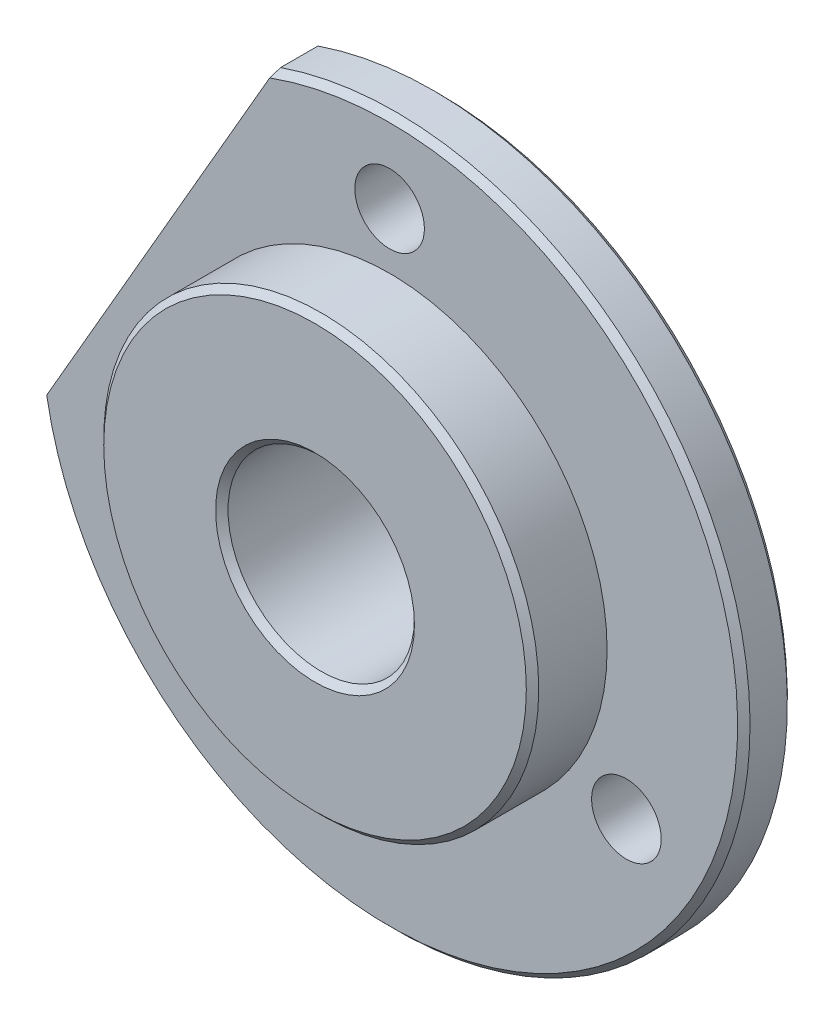
ISO-10303-21;
HEADER;
FILE_DESCRIPTION(('STEP AP214'),'2;1');
FILE_NAME('part.step','',(''),(''),'','','');
FILE_SCHEMA(('AUTOMOTIVE_DESIGN { 1 0 10303 214 1 1 1 1 }'));
ENDSEC;
DATA;
#1=APPLICATION_CONTEXT('core data for automotive mechanical design processes');
#2=APPLICATION_PROTOCOL_DEFINITION('international standard','automotive_design',2000,#1);
#3=PRODUCT_CONTEXT('',#1,'mechanical');
#4=PRODUCT('Part','Part','',(#3));
#5=PRODUCT_RELATED_PRODUCT_CATEGORY('part','',(#4));
#6=PRODUCT_DEFINITION_FORMATION('','',#4);
#7=PRODUCT_DEFINITION_CONTEXT('part definition',#1,'design');
#8=PRODUCT_DEFINITION('design','',#6,#7);
#9=PRODUCT_DEFINITION_SHAPE('','',#8);
#10=(LENGTH_UNIT() NAMED_UNIT(*) SI_UNIT(.MILLI.,.METRE.));
#11=(NAMED_UNIT(*) PLANE_ANGLE_UNIT() SI_UNIT($,.RADIAN.));
#12=(NAMED_UNIT(*) SI_UNIT($,.STERADIAN.) SOLID_ANGLE_UNIT());
#13=UNCERTAINTY_MEASURE_WITH_UNIT(LENGTH_MEASURE(1.E-05),#10,'distance_accuracy_value','');
#14=(GEOMETRIC_REPRESENTATION_CONTEXT(3) GLOBAL_UNCERTAINTY_ASSIGNED_CONTEXT((#13)) GLOBAL_UNIT_ASSIGNED_CONTEXT((#10,
#11,#12)) REPRESENTATION_CONTEXT('',''));
#15=CARTESIAN_POINT('',(0.,0.,0.));
#16=DIRECTION('',(0.,0.,1.));
#17=DIRECTION('',(1.,0.,0.));
#18=AXIS2_PLACEMENT_3D('',#15,#16,#17);
#19=CARTESIAN_POINT('',(0.,0.,20.3950347257728));
#20=DIRECTION('',(0.,0.,-1.));
#21=DIRECTION('',(-1.,0.,0.));
#22=AXIS2_PLACEMENT_3D('',#19,#20,#21);
#23=CYLINDRICAL_SURFACE('',#22,28.5);
#24=DIRECTION('',(0.,0.,-1.));
#25=VECTOR('',#24,1.);
#26=CARTESIAN_POINT('',(-27.9736896483002,-5.45185174602017,20.3950347257728));
#27=LINE('',#26,#25);
#28=CARTESIAN_POINT('',(-27.9736896483002,-5.45185174602017,16.8950347257733));
#29=VERTEX_POINT('',#28);
#30=CARTESIAN_POINT('',(-27.9736896483002,-5.45185174602017,19.8950347257728));
#31=VERTEX_POINT('',#30);
#32=EDGE_CURVE('E164',#29,#31,#27,.F.);
#33=ORIENTED_EDGE('',*,*,#32,.F.);
#34=CARTESIAN_POINT('',(0.,0.,16.8950347257733));
#35=DIRECTION('',(0.,0.,1.));
#36=DIRECTION('',(1.,0.,0.));
#37=AXIS2_PLACEMENT_3D('',#34,#35,#36);
#38=CIRCLE('',#37,28.5);
#39=CARTESIAN_POINT('',(-9.26540271443014,26.9518517460198,16.8950347257733));
#40=VERTEX_POINT('',#39);
#41=EDGE_CURVE('E192',#29,#40,#38,.T.);
#42=ORIENTED_EDGE('',*,*,#41,.T.);
#43=DIRECTION('',(0.,0.,-1.));
#44=VECTOR('',#43,1.);
#45=CARTESIAN_POINT('',(-9.26540271443014,26.9518517460198,20.3950347257728));
#46=LINE('',#45,#44);
#47=CARTESIAN_POINT('',(-9.26540271443014,26.9518517460198,19.8950347257728));
#48=VERTEX_POINT('',#47);
#49=EDGE_CURVE('E471',#48,#40,#46,.T.);
#50=ORIENTED_EDGE('',*,*,#49,.F.);
#51=CARTESIAN_POINT('',(0.,0.,19.8950347257728));
#52=DIRECTION('',(0.,0.,1.));
#53=DIRECTION('',(1.,0.,0.));
#54=AXIS2_PLACEMENT_3D('',#51,#52,#53);
#55=CIRCLE('',#54,28.5);
#56=EDGE_CURVE('E189',#48,#31,#55,.F.);
#57=ORIENTED_EDGE('',*,*,#56,.T.);
#58=EDGE_LOOP('',(#33,#42,#50,#57));
#59=FACE_BOUND('',#58,.T.);
#60=ADVANCED_FACE('F50',(#59),#23,.T.);
#61=CARTESIAN_POINT('',(0.,0.,20.3950347257728));
#62=DIRECTION('',(0.,0.,1.));
#63=DIRECTION('',(1.,0.,0.));
#64=AXIS2_PLACEMENT_3D('',#61,#62,#63);
#65=PLANE('',#64);
#66=CARTESIAN_POINT('',(-1.94289029309402E-13,22.,20.3950347257726));
#67=DIRECTION('',(0.,0.,-1.));
#68=DIRECTION('',(-0.5,-0.866025403784439,0.));
#69=AXIS2_PLACEMENT_3D('',#66,#67,#68);
#70=CIRCLE('',#69,2.8);
#71=CARTESIAN_POINT('',(-1.4000000000002,19.5751288694035,20.3950347257726));
#72=VERTEX_POINT('',#71);
#73=EDGE_CURVE('E178',#72,#72,#70,.T.);
#74=ORIENTED_EDGE('',*,*,#73,.T.);
#75=EDGE_LOOP('',(#74));
#76=FACE_BOUND('',#75,.T.);
#77=CARTESIAN_POINT('',(19.0525588832575,-10.9999999999998,20.3950347257726));
#78=DIRECTION('',(0.,0.,-1.));
#79=DIRECTION('',(-0.5,0.866025403784439,0.));
#80=AXIS2_PLACEMENT_3D('',#77,#78,#79);
#81=CIRCLE('',#80,2.8);
#82=CARTESIAN_POINT('',(17.6525588832575,-8.57512886940342,20.3950347257726));
#83=VERTEX_POINT('',#82);
#84=EDGE_CURVE('E174',#83,#83,#81,.T.);
#85=ORIENTED_EDGE('',*,*,#84,.T.);
#86=EDGE_LOOP('',(#85));
#87=FACE_BOUND('',#86,.T.);
#88=CARTESIAN_POINT('',(-19.0525588832577,-11.,20.3950347257726));
#89=DIRECTION('',(0.,0.,-1.));
#90=DIRECTION('',(1.,0.,0.));
#91=AXIS2_PLACEMENT_3D('',#88,#89,#90);
#92=CIRCLE('',#91,2.8);
#93=CARTESIAN_POINT('',(-16.2525588832577,-11.,20.3950347257726));
#94=VERTEX_POINT('',#93);
#95=EDGE_CURVE('E159',#94,#94,#92,.T.);
#96=ORIENTED_EDGE('',*,*,#95,.T.);
#97=EDGE_LOOP('',(#96));
#98=FACE_BOUND('',#97,.T.);
#99=CARTESIAN_POINT('',(0.,0.,20.3950347257728));
#100=DIRECTION('',(0.,0.,1.));
#101=DIRECTION('',(1.,0.,0.));
#102=AXIS2_PLACEMENT_3D('',#99,#100,#101);
#103=CIRCLE('',#102,17.5);
#104=CARTESIAN_POINT('',(17.5,0.,20.3950347257728));
#105=VERTEX_POINT('',#104);
#106=EDGE_CURVE('E470',#105,#105,#103,.T.);
#107=ORIENTED_EDGE('',*,*,#106,.F.);
#108=EDGE_LOOP('',(#107));
#109=FACE_BOUND('',#108,.T.);
#110=DIRECTION('',(-0.5,-0.866025403784439,0.));
#111=VECTOR('',#110,1.);
#112=CARTESIAN_POINT('',(-8.09416053474007,28.9805027092108,20.3950347257727));
#113=LINE('',#112,#111);
#114=CARTESIAN_POINT('',(-9.65085062403894,26.2842363829062,20.3950347257727));
#115=VERTEX_POINT('',#114);
#116=CARTESIAN_POINT('',(-27.5882417386914,-4.78423638290651,20.3950347257727));
#117=VERTEX_POINT('',#116);
#118=EDGE_CURVE('E158',#115,#117,#113,.T.);
#119=ORIENTED_EDGE('',*,*,#118,.T.);
#120=CARTESIAN_POINT('',(0.,0.,20.3950347257728));
#121=DIRECTION('',(0.,0.,1.));
#122=DIRECTION('',(1.,0.,0.));
#123=AXIS2_PLACEMENT_3D('',#120,#121,#122);
#124=CIRCLE('',#123,28.);
#125=EDGE_CURVE('E286',#117,#115,#124,.T.);
#126=ORIENTED_EDGE('',*,*,#125,.T.);
#127=EDGE_LOOP('',(#119,#126));
#128=FACE_BOUND('',#127,.T.);
#129=ADVANCED_FACE('F245',(#76,#87,#98,#109,#128),#65,.T.);
#130=CARTESIAN_POINT('',(0.,0.,16.3950347257733));
#131=DIRECTION('',(0.,0.,1.));
#132=DIRECTION('',(1.,0.,0.));
#133=AXIS2_PLACEMENT_3D('',#130,#131,#132);
#134=PLANE('',#133);
#135=CARTESIAN_POINT('',(-1.94289029309402E-13,22.,16.3950347257733));
#136=DIRECTION('',(0.,0.,1.));
#137=DIRECTION('',(1.,0.,0.));
#138=AXIS2_PLACEMENT_3D('',#135,#136,#137);
#139=CIRCLE('',#138,2.8);
#140=CARTESIAN_POINT('',(2.7999999999998,22.,16.3950347257733));
#141=VERTEX_POINT('',#140);
#142=EDGE_CURVE('E175',#141,#141,#139,.F.);
#143=ORIENTED_EDGE('',*,*,#142,.F.);
#144=EDGE_LOOP('',(#143));
#145=FACE_BOUND('',#144,.T.);
#146=CARTESIAN_POINT('',(19.0525588832575,-10.9999999999998,16.3950347257733));
#147=DIRECTION('',(0.,0.,1.));
#148=DIRECTION('',(1.,0.,0.));
#149=AXIS2_PLACEMENT_3D('',#146,#147,#148);
#150=CIRCLE('',#149,2.8);
#151=CARTESIAN_POINT('',(21.8525588832575,-10.9999999999998,16.3950347257733));
#152=VERTEX_POINT('',#151);
#153=EDGE_CURVE('E167',#152,#152,#150,.F.);
#154=ORIENTED_EDGE('',*,*,#153,.F.);
#155=EDGE_LOOP('',(#154));
#156=FACE_BOUND('',#155,.T.);
#157=CARTESIAN_POINT('',(-19.0525588832577,-11.,16.3950347257733));
#158=DIRECTION('',(0.,0.,1.));
#159=DIRECTION('',(1.,0.,0.));
#160=AXIS2_PLACEMENT_3D('',#157,#158,#159);
#161=CIRCLE('',#160,2.8);
#162=CARTESIAN_POINT('',(-16.2525588832577,-11.,16.3950347257733));
#163=VERTEX_POINT('',#162);
#164=EDGE_CURVE('E153',#163,#163,#161,.F.);
#165=ORIENTED_EDGE('',*,*,#164,.F.);
#166=EDGE_LOOP('',(#165));
#167=FACE_BOUND('',#166,.T.);
#168=CARTESIAN_POINT('',(0.,0.,16.3950347257733));
#169=DIRECTION('',(0.,0.,-1.));
#170=DIRECTION('',(1.,0.,0.));
#171=AXIS2_PLACEMENT_3D('',#168,#169,#170);
#172=CIRCLE('',#171,11.);
#173=CARTESIAN_POINT('',(11.,0.,16.3950347257733));
#174=VERTEX_POINT('',#173);
#175=EDGE_CURVE('E468',#174,#174,#172,.T.);
#176=ORIENTED_EDGE('',*,*,#175,.F.);
#177=EDGE_LOOP('',(#176));
#178=FACE_BOUND('',#177,.T.);
#179=DIRECTION('',(-0.5,-0.866025403784439,0.));
#180=VECTOR('',#179,1.);
#181=CARTESIAN_POINT('',(-18.6195461813652,10.7499999999998,16.3950347257733));
#182=LINE('',#181,#180);
#183=CARTESIAN_POINT('',(-9.65085062403893,26.2842363829062,16.3950347257733));
#184=VERTEX_POINT('',#183);
#185=CARTESIAN_POINT('',(-27.5882417386914,-4.78423638290652,16.3950347257733));
#186=VERTEX_POINT('',#185);
#187=EDGE_CURVE('E171',#184,#186,#182,.T.);
#188=ORIENTED_EDGE('',*,*,#187,.F.);
#189=CARTESIAN_POINT('',(0.,0.,16.3950347257733));
#190=DIRECTION('',(0.,0.,1.));
#191=DIRECTION('',(1.,0.,0.));
#192=AXIS2_PLACEMENT_3D('',#189,#190,#191);
#193=CIRCLE('',#192,28.);
#194=EDGE_CURVE('E284',#184,#186,#193,.F.);
#195=ORIENTED_EDGE('',*,*,#194,.T.);
#196=EDGE_LOOP('',(#188,#195));
#197=FACE_BOUND('',#196,.T.);
#198=ADVANCED_FACE('F251',(#145,#156,#167,#178,#197),#134,.F.);
#199=CARTESIAN_POINT('',(0.,0.,5.99503472577306));
#200=DIRECTION('',(0.,0.,1.));
#201=DIRECTION('',(-1.,0.,0.));
#202=AXIS2_PLACEMENT_3D('',#199,#200,#201);
#203=CYLINDRICAL_SURFACE('',#202,11.);
#204=CARTESIAN_POINT('',(0.,11.,9.59503472577307));
#205=CARTESIAN_POINT('',(0.116820725576944,10.9999978716946,9.59503914708373));
#206=CARTESIAN_POINT('',(0.233698534099584,10.998119850411,9.60481558062744));
#207=CARTESIAN_POINT('',(0.464157905615967,10.9908091013027,9.64363626190238));
#208=CARTESIAN_POINT('',(0.57773664830955,10.9853734203977,9.67269651669106));
#209=CARTESIAN_POINT('',(0.798231854962633,10.971555114344,9.74916040343549));
#210=CARTESIAN_POINT('',(0.905154329044485,10.9631751944279,9.79654720056781));
#211=CARTESIAN_POINT('',(1.10952197105222,10.9443823920309,9.90827064418986));
#212=CARTESIAN_POINT('',(1.20696785099233,10.9339696624603,9.97260601591655));
#213=CARTESIAN_POINT('',(1.39083315056374,10.9121153708468,10.1172465329172));
#214=CARTESIAN_POINT('',(1.47711814339733,10.9006636700964,10.1977210454418));
#215=CARTESIAN_POINT('',(1.63504914599608,10.8780969643664,10.3719912012417));
#216=CARTESIAN_POINT('',(1.70669408031201,10.8669819841731,10.4657878222931));
#217=CARTESIAN_POINT('',(1.83387383294999,10.846248530383,10.6649941861905));
#218=CARTESIAN_POINT('',(1.88927125270465,10.8366431219602,10.7704931283785));
#219=CARTESIAN_POINT('',(1.98150370285159,10.8201595335974,10.98951459304));
#220=CARTESIAN_POINT('',(2.01834039568987,10.8132811094188,11.1030363958834));
#221=CARTESIAN_POINT('',(2.07197297779094,10.8031324791883,11.3334406144317));
#222=CARTESIAN_POINT('',(2.08900368367653,10.7998200312509,11.4502664726619));
#223=CARTESIAN_POINT('',(2.10326984536433,10.7970511009874,11.6851607628698));
#224=CARTESIAN_POINT('',(2.10050714236934,10.7975942600088,11.8032290782526));
#225=CARTESIAN_POINT('',(2.07545516737426,10.8024367355995,12.0355510866324));
#226=CARTESIAN_POINT('',(2.05343348606592,10.8066845758642,12.1498348665908));
#227=CARTESIAN_POINT('',(1.99091034192166,10.8183768812613,12.3730554009638));
#228=CARTESIAN_POINT('',(1.95040806775305,10.8258214867369,12.481991920391));
#229=CARTESIAN_POINT('',(1.85181340852171,10.8431219988389,12.6922054344847));
#230=CARTESIAN_POINT('',(1.79361350474933,10.8529925716594,12.793430743651));
#231=CARTESIAN_POINT('',(1.66135166063383,10.8740232315002,12.9847793458424));
#232=CARTESIAN_POINT('',(1.5872880534515,10.8851834539704,13.0749014706595));
#233=CARTESIAN_POINT('',(1.42396113527216,10.9077598901504,13.2430310039915));
#234=CARTESIAN_POINT('',(1.33446907578982,10.9191773056637,13.3208162072706));
#235=CARTESIAN_POINT('',(1.14358963010241,10.9408141182614,13.4603039737921));
#236=CARTESIAN_POINT('',(1.04220211619592,10.9510335024823,13.5220063643575));
#237=CARTESIAN_POINT('',(0.830173985720091,10.9691445924971,13.6276119633276));
#238=CARTESIAN_POINT('',(0.719521272357275,10.9770331923933,13.671491450637));
#239=CARTESIAN_POINT('',(0.492231221002959,10.9895700020058,13.7399777442366));
#240=CARTESIAN_POINT('',(0.375594543986819,10.994218568785,13.7645866742472));
#241=CARTESIAN_POINT('',(0.14155857078908,10.9997023168961,13.7935225953311));
#242=CARTESIAN_POINT('',(0.0241982028024535,11.0005947180859,13.7981539438369));
#243=CARTESIAN_POINT('',(-0.209619824877444,10.9986238776324,13.7878205140451));
#244=CARTESIAN_POINT('',(-0.326077530314277,10.9957608275698,13.7728567353733));
#245=CARTESIAN_POINT('',(-0.553814645909537,10.9866364587913,13.7240108144022));
#246=CARTESIAN_POINT('',(-0.665128421406164,10.9804029187552,13.6902832533981));
#247=CARTESIAN_POINT('',(-0.880521177551999,10.9652337163749,13.6050348864641));
#248=CARTESIAN_POINT('',(-0.984599652469112,10.9562978653781,13.5535128382367));
#249=CARTESIAN_POINT('',(-1.18386224069497,10.9365725392396,13.4334684454554));
#250=CARTESIAN_POINT('',(-1.27893275643845,10.9257632883234,13.3647608559687));
#251=CARTESIAN_POINT('',(-1.45630391231596,10.9035399615061,13.2125457010323));
#252=CARTESIAN_POINT('',(-1.53860331172027,10.8921258269841,13.1290366992934));
#253=CARTESIAN_POINT('',(-1.68925742062279,10.8697885323371,12.9482092694096));
#254=CARTESIAN_POINT('',(-1.75740408816819,10.8588743179934,12.8507162227844));
#255=CARTESIAN_POINT('',(-1.87635388160976,10.8389551363277,12.6454878439318));
#256=CARTESIAN_POINT('',(-1.92715766623363,10.8299500964951,12.537752900917));
#257=CARTESIAN_POINT('',(-2.00968750691374,10.8149396007345,12.3156177666262));
#258=CARTESIAN_POINT('',(-2.0415074890195,10.8089194021741,12.2012535147169));
#259=CARTESIAN_POINT('',(-2.08545491288345,10.8005271750239,11.9686757538008));
#260=CARTESIAN_POINT('',(-2.09758466771721,10.7981547179237,11.8504626985901));
#261=CARTESIAN_POINT('',(-2.10172771567789,10.7973488784542,11.6156281377085));
#262=CARTESIAN_POINT('',(-2.09406932225051,10.7988512071435,11.4990125191777));
#263=CARTESIAN_POINT('',(-2.05957380647279,10.8054828208103,11.2687637866407));
#264=CARTESIAN_POINT('',(-2.03273680883038,10.8106120822039,11.1551306532462));
#265=CARTESIAN_POINT('',(-1.96078655360532,10.8238920998987,10.9342577461912));
#266=CARTESIAN_POINT('',(-1.91571010674722,10.8320367677302,10.8270055916178));
#267=CARTESIAN_POINT('',(-1.80859687396578,10.8504339754288,10.6215341759364));
#268=CARTESIAN_POINT('',(-1.74655882937287,10.8606866717125,10.5233155859055));
#269=CARTESIAN_POINT('',(-1.60614737217546,10.882343519302,10.3370573732936));
#270=CARTESIAN_POINT('',(-1.52753550738089,10.8937630641247,10.2491992672889));
#271=CARTESIAN_POINT('',(-1.35670385401088,10.9163530130373,10.0878121588375));
#272=CARTESIAN_POINT('',(-1.26448094399106,10.9275233592998,10.0142864522648));
#273=CARTESIAN_POINT('',(-1.06800710017792,10.9484794793606,9.88300462307268));
#274=CARTESIAN_POINT('',(-0.963651395128439,10.9582512733661,9.82540299247188));
#275=CARTESIAN_POINT('',(-0.74658886485383,10.9751724982229,9.728642698514));
#276=CARTESIAN_POINT('',(-0.633889912861657,10.9823243644284,9.68946689775509));
#277=CARTESIAN_POINT('',(-0.434066702020293,10.9917600690319,9.63852715651208));
#278=CARTESIAN_POINT('',(-0.348102728929784,10.9948324249591,9.62224568730497));
#279=CARTESIAN_POINT('',(-0.174769795845607,10.9989531592246,9.60049796429922));
#280=CARTESIAN_POINT('',(-0.0874008739257631,11.0000015923181,9.59503141791469));
#281=CARTESIAN_POINT('',(0.,11.,9.59503472577307));
#282=B_SPLINE_CURVE_WITH_KNOTS('',3,(#204,#205,#206,#207,#208,#209,#210,#211,#212,#213,#214,
#215,#216,#217,#218,#219,#220,#221,#222,#223,#224,#225,#226,#227,#228,#229,#230,#231,#232,#233,
#234,#235,#236,#237,#238,#239,#240,#241,#242,#243,#244,#245,#246,#247,#248,#249,#250,#251,#252,
#253,#254,#255,#256,#257,#258,#259,#260,#261,#262,#263,#264,#265,#266,#267,#268,#269,#270,#271,
#272,#273,#274,#275,#276,#277,#278,#279,#280,#281),.UNSPECIFIED.,.T.,.F.,(4,2,2,2,2,2,2,2,2,2,2,
2,2,2,2,2,2,2,2,2,2,2,2,2,2,2,2,2,2,2,2,2,2,2,2,2,2,2,4),(0.,0.350142517562091,
0.700576044571203,1.05068842385536,1.40077447744675,1.7547471970617,2.10874590994354,
2.46565720490661,2.82253652637637,3.17514016136572,3.52771099723601,3.87545955963107,
4.22322339030958,4.5731437012802,4.92310079731015,5.27878057366823,5.6344641687088,
5.99061961582656,6.34673580714868,6.69740698623476,7.0480602768805,7.39586667355603,
7.74369735676448,8.09545238647772,8.44724156826096,8.80388396846403,9.16051282095549,
9.51536222599584,9.87016994269547,10.2191288359621,10.5680854601612,10.9163413075931,
11.2646230050701,11.6183069023624,11.9720720369891,12.3291576381856,12.6859104630516,
12.9478810152831,13.2098444800908),.UNSPECIFIED.);
#283=CARTESIAN_POINT('',(0.,11.,9.59503472577307));
#284=VERTEX_POINT('',#283);
#285=EDGE_CURVE('E327',#284,#284,#282,.T.);
#286=ORIENTED_EDGE('',*,*,#285,.T.);
#287=EDGE_LOOP('',(#286));
#288=FACE_BOUND('',#287,.T.);
#289=CARTESIAN_POINT('',(11.,0.,13.7950347257731));
#290=CARTESIAN_POINT('',(10.9999978716946,0.116820725576944,13.7950303044624));
#291=CARTESIAN_POINT('',(10.998119850411,0.233698534099584,13.7852538709187));
#292=CARTESIAN_POINT('',(10.9908091013027,0.464157905615969,13.7464331896438));
#293=CARTESIAN_POINT('',(10.9853734203977,0.577736648309552,13.7173729348551));
#294=CARTESIAN_POINT('',(10.971555114344,0.798231854962635,13.6409090481106));
#295=CARTESIAN_POINT('',(10.9631751944279,0.905154329044487,13.5935222509783));
#296=CARTESIAN_POINT('',(10.9443823920309,1.10952197105222,13.4817988073563));
#297=CARTESIAN_POINT('',(10.9339696624603,1.20696785099233,13.4174634356296));
#298=CARTESIAN_POINT('',(10.9121153708468,1.39083315056375,13.2728229186289));
#299=CARTESIAN_POINT('',(10.9006636700964,1.47711814339733,13.1923484061043));
#300=CARTESIAN_POINT('',(10.8780969643664,1.63504914599609,13.0180782503044));
#301=CARTESIAN_POINT('',(10.8669819841731,1.70669408031202,12.924281629253));
#302=CARTESIAN_POINT('',(10.846248530383,1.83387383294999,12.7250752653556));
#303=CARTESIAN_POINT('',(10.8366431219602,1.88927125270465,12.6195763231676));
#304=CARTESIAN_POINT('',(10.8201595335974,1.98150370285159,12.4005548585062));
#305=CARTESIAN_POINT('',(10.8132811094188,2.01834039568988,12.2870330556628));
#306=CARTESIAN_POINT('',(10.8031324791883,2.07197297779094,12.0566288371144));
#307=CARTESIAN_POINT('',(10.7998200312509,2.08900368367654,11.9398029788842));
#308=CARTESIAN_POINT('',(10.7970511009874,2.10326984536434,11.7049086886763));
#309=CARTESIAN_POINT('',(10.7975942600088,2.10050714236935,11.5868403732935));
#310=CARTESIAN_POINT('',(10.8024367355995,2.07545516737427,11.3545183649138));
#311=CARTESIAN_POINT('',(10.8066845758642,2.05343348606592,11.2402345849553));
#312=CARTESIAN_POINT('',(10.8183768812613,1.99091034192167,11.0170140505823));
#313=CARTESIAN_POINT('',(10.8258214867369,1.95040806775306,10.9080775311551));
#314=CARTESIAN_POINT('',(10.8431219988389,1.85181340852171,10.6978640170614));
#315=CARTESIAN_POINT('',(10.8529925716594,1.79361350474933,10.5966387078951));
#316=CARTESIAN_POINT('',(10.8740232315002,1.66135166063383,10.4052901057037));
#317=CARTESIAN_POINT('',(10.8851834539704,1.5872880534515,10.3151679808866));
#318=CARTESIAN_POINT('',(10.9077598901504,1.42396113527216,10.1470384475546));
#319=CARTESIAN_POINT('',(10.9191773056637,1.33446907578983,10.0692532442755));
#320=CARTESIAN_POINT('',(10.9408141182614,1.14358963010241,9.92976547775399));
#321=CARTESIAN_POINT('',(10.9510335024823,1.04220211619593,9.86806308718858));
#322=CARTESIAN_POINT('',(10.9691445924971,0.830173985720095,9.76245748821856));
#323=CARTESIAN_POINT('',(10.9770331923933,0.719521272357278,9.71857800090916));
#324=CARTESIAN_POINT('',(10.9895700020058,0.492231221002961,9.65009170730953));
#325=CARTESIAN_POINT('',(10.994218568785,0.375594543986821,9.62548277729895));
#326=CARTESIAN_POINT('',(10.9997023168961,0.141558570789083,9.59654685621501));
#327=CARTESIAN_POINT('',(11.0005947180859,0.0241982028024558,9.59191550770926));
#328=CARTESIAN_POINT('',(10.9986238776324,-0.209619824877442,9.60224893750101));
#329=CARTESIAN_POINT('',(10.9957608275698,-0.326077530314276,9.61721271617282));
#330=CARTESIAN_POINT('',(10.9866364587913,-0.553814645909537,9.66605863714388));
#331=CARTESIAN_POINT('',(10.9804029187552,-0.665128421406164,9.69978619814803));
#332=CARTESIAN_POINT('',(10.9652337163749,-0.880521177551999,9.78503456508202));
#333=CARTESIAN_POINT('',(10.9562978653781,-0.984599652469114,9.8365566133094));
#334=CARTESIAN_POINT('',(10.9365725392395,-1.18386224069497,9.95660100609071));
#335=CARTESIAN_POINT('',(10.9257632883234,-1.27893275643845,10.0253085955774));
#336=CARTESIAN_POINT('',(10.9035399615061,-1.45630391231597,10.1775237505138));
#337=CARTESIAN_POINT('',(10.8921258269841,-1.53860331172027,10.2610327522528));
#338=CARTESIAN_POINT('',(10.8697885323371,-1.68925742062279,10.4418601821366));
#339=CARTESIAN_POINT('',(10.8588743179934,-1.75740408816819,10.5393532287617));
#340=CARTESIAN_POINT('',(10.8389551363277,-1.87635388160976,10.7445816076143));
#341=CARTESIAN_POINT('',(10.8299500964951,-1.92715766623364,10.8523165506291));
#342=CARTESIAN_POINT('',(10.8149396007345,-2.00968750691375,11.07445168492));
#343=CARTESIAN_POINT('',(10.8089194021741,-2.04150748901951,11.1888159368292));
#344=CARTESIAN_POINT('',(10.8005271750239,-2.08545491288345,11.4213936977453));
#345=CARTESIAN_POINT('',(10.7981547179237,-2.09758466771721,11.5396067529561));
#346=CARTESIAN_POINT('',(10.7973488784542,-2.10172771567789,11.7744413138376));
#347=CARTESIAN_POINT('',(10.7988512071435,-2.09406932225052,11.8910569323685));
#348=CARTESIAN_POINT('',(10.8054828208103,-2.0595738064728,12.1213056649054));
#349=CARTESIAN_POINT('',(10.8106120822039,-2.03273680883039,12.2349387983));
#350=CARTESIAN_POINT('',(10.8238920998987,-1.96078655360532,12.4558117053549));
#351=CARTESIAN_POINT('',(10.8320367677302,-1.91571010674722,12.5630638599283));
#352=CARTESIAN_POINT('',(10.8504339754288,-1.80859687396579,12.7685352756097));
#353=CARTESIAN_POINT('',(10.8606866717125,-1.74655882937287,12.8667538656407));
#354=CARTESIAN_POINT('',(10.882343519302,-1.60614737217547,13.0530120782525));
#355=CARTESIAN_POINT('',(10.8937630641247,-1.52753550738089,13.1408701842572));
#356=CARTESIAN_POINT('',(10.9163530130373,-1.35670385401088,13.3022572927086));
#357=CARTESIAN_POINT('',(10.9275233592998,-1.26448094399107,13.3757829992813));
#358=CARTESIAN_POINT('',(10.9484794793606,-1.06800710017792,13.5070648284734));
#359=CARTESIAN_POINT('',(10.9582512733661,-0.963651395128445,13.5646664590742));
#360=CARTESIAN_POINT('',(10.9751724982229,-0.746588864853835,13.6614267530321));
#361=CARTESIAN_POINT('',(10.9823243644284,-0.633889912861661,13.700602553791));
#362=CARTESIAN_POINT('',(10.9917600690319,-0.434066702020296,13.751542295034));
#363=CARTESIAN_POINT('',(10.9948324249591,-0.348102728929786,13.7678237642412));
#364=CARTESIAN_POINT('',(10.9989531592246,-0.174769795845608,13.7895714872469));
#365=CARTESIAN_POINT('',(11.0000015923181,-0.0874008739257637,13.7950380336314));
#366=CARTESIAN_POINT('',(11.,0.,13.7950347257731));
#367=B_SPLINE_CURVE_WITH_KNOTS('',3,(#289,#290,#291,#292,#293,#294,#295,#296,#297,#298,#299,
#300,#301,#302,#303,#304,#305,#306,#307,#308,#309,#310,#311,#312,#313,#314,#315,#316,#317,#318,
#319,#320,#321,#322,#323,#324,#325,#326,#327,#328,#329,#330,#331,#332,#333,#334,#335,#336,#337,
#338,#339,#340,#341,#342,#343,#344,#345,#346,#347,#348,#349,#350,#351,#352,#353,#354,#355,#356,
#357,#358,#359,#360,#361,#362,#363,#364,#365,#366),.UNSPECIFIED.,.T.,.F.,(4,2,2,2,2,2,2,2,2,2,2,
2,2,2,2,2,2,2,2,2,2,2,2,2,2,2,2,2,2,2,2,2,2,2,2,2,2,2,4),(0.,0.350142517562091,
0.700576044571205,1.05068842385536,1.40077447744676,1.75474719706171,2.10874590994354,
2.46565720490662,2.82253652637638,3.17514016136573,3.52771099723602,3.87545955963108,
4.2232233903096,4.57314370128021,4.92310079731016,5.27878057366824,5.63446416870882,
5.99061961582658,6.3467358071487,6.69740698623478,7.04806027688052,7.39586667355605,
7.74369735676451,8.09545238647775,8.44724156826098,8.80388396846406,9.16051282095551,
9.51536222599587,9.87016994269549,10.2191288359621,10.5680854601613,10.9163413075931,
11.2646230050702,11.6183069023625,11.9720720369892,12.3291576381857,12.6859104630517,
12.9478810152831,13.2098444800909),.UNSPECIFIED.);
#368=CARTESIAN_POINT('',(11.,0.,13.7950347257731));
#369=VERTEX_POINT('',#368);
#370=EDGE_CURVE('E326',#369,#369,#367,.T.);
#371=ORIENTED_EDGE('',*,*,#370,.T.);
#372=EDGE_LOOP('',(#371));
#373=FACE_BOUND('',#372,.T.);
#374=CARTESIAN_POINT('',(0.,0.,7.49503472577306));
#375=DIRECTION('',(0.,0.,1.));
#376=DIRECTION('',(1.,0.,0.));
#377=AXIS2_PLACEMENT_3D('',#374,#375,#376);
#378=CIRCLE('',#377,11.);
#379=CARTESIAN_POINT('',(11.,0.,7.49503472577306));
#380=VERTEX_POINT('',#379);
#381=EDGE_CURVE('E11',#380,#380,#378,.T.);
#382=ORIENTED_EDGE('',*,*,#381,.T.);
#383=EDGE_LOOP('',(#382));
#384=FACE_BOUND('',#383,.T.);
#385=ORIENTED_EDGE('',*,*,#175,.T.);
#386=EDGE_LOOP('',(#385));
#387=FACE_BOUND('',#386,.T.);
#388=ADVANCED_FACE('F348',(#288,#373,#384,#387),#203,.T.);
#389=CARTESIAN_POINT('',(0.,0.,26.3950347257726));
#390=DIRECTION('',(0.,0.,-1.));
#391=DIRECTION('',(-1.,0.,0.));
#392=AXIS2_PLACEMENT_3D('',#389,#390,#391);
#393=CYLINDRICAL_SURFACE('',#392,17.5);
#394=CARTESIAN_POINT('',(0.,0.,25.8950347257726));
#395=DIRECTION('',(0.,0.,1.));
#396=DIRECTION('',(1.,0.,0.));
#397=AXIS2_PLACEMENT_3D('',#394,#395,#396);
#398=CIRCLE('',#397,17.5);
#399=CARTESIAN_POINT('',(17.5,0.,25.8950347257726));
#400=VERTEX_POINT('',#399);
#401=EDGE_CURVE('E74',#400,#400,#398,.F.);
#402=ORIENTED_EDGE('',*,*,#401,.T.);
#403=EDGE_LOOP('',(#402));
#404=FACE_BOUND('',#403,.T.);
#405=ORIENTED_EDGE('',*,*,#106,.T.);
#406=EDGE_LOOP('',(#405));
#407=FACE_BOUND('',#406,.T.);
#408=ADVANCED_FACE('F298',(#404,#407),#393,.T.);
#409=CARTESIAN_POINT('',(0.,0.,26.3950347257726));
#410=DIRECTION('',(0.,0.,1.));
#411=DIRECTION('',(1.,0.,0.));
#412=AXIS2_PLACEMENT_3D('',#409,#410,#411);
#413=PLANE('',#412);
#414=CARTESIAN_POINT('',(0.,0.,26.3950347257726));
#415=DIRECTION('',(0.,0.,1.));
#416=DIRECTION('',(1.,0.,0.));
#417=AXIS2_PLACEMENT_3D('',#414,#415,#416);
#418=CIRCLE('',#417,8.);
#419=CARTESIAN_POINT('',(8.,0.,26.3950347257726));
#420=VERTEX_POINT('',#419);
#421=EDGE_CURVE('E184',#420,#420,#418,.F.);
#422=ORIENTED_EDGE('',*,*,#421,.T.);
#423=EDGE_LOOP('',(#422));
#424=FACE_BOUND('',#423,.T.);
#425=CARTESIAN_POINT('',(0.,0.,26.3950347257726));
#426=DIRECTION('',(0.,0.,1.));
#427=DIRECTION('',(1.,0.,0.));
#428=AXIS2_PLACEMENT_3D('',#425,#426,#427);
#429=CIRCLE('',#428,17.);
#430=CARTESIAN_POINT('',(17.,0.,26.3950347257726));
#431=VERTEX_POINT('',#430);
#432=EDGE_CURVE('E80',#431,#431,#429,.T.);
#433=ORIENTED_EDGE('',*,*,#432,.T.);
#434=EDGE_LOOP('',(#433));
#435=FACE_BOUND('',#434,.T.);
#436=ADVANCED_FACE('F302',(#424,#435),#413,.T.);
#437=CARTESIAN_POINT('',(0.,0.,-7.62737963362596));
#438=DIRECTION('',(0.,0.,1.));
#439=DIRECTION('',(-1.,0.,0.));
#440=AXIS2_PLACEMENT_3D('',#437,#438,#439);
#441=CYLINDRICAL_SURFACE('',#440,7.5);
#442=CARTESIAN_POINT('',(0.,7.5,9.59503472577307));
#443=CARTESIAN_POINT('',(0.115549071859457,7.49999850044544,9.59503699170472));
#444=CARTESIAN_POINT('',(0.231121705110065,7.4973036885812,9.60460342738784));
#445=CARTESIAN_POINT('',(0.458923495634751,7.48681582636739,9.64253980837897));
#446=CARTESIAN_POINT('',(0.571151263080414,7.47902068682222,9.67091745919722));
#447=CARTESIAN_POINT('',(0.788943238195506,7.45919014801396,9.74547070565651));
#448=CARTESIAN_POINT('',(0.894516296930382,7.4471605273756,9.79162205428635));
#449=CARTESIAN_POINT('',(1.09642476541401,7.420124150391,9.90031899394834));
#450=CARTESIAN_POINT('',(1.19275931288064,7.40511711654645,9.96286611325969));
#451=CARTESIAN_POINT('',(1.37589761639296,7.37331332850794,10.1042515844632));
#452=CARTESIAN_POINT('',(1.46243395483419,7.35648356700851,10.1834288976835));
#453=CARTESIAN_POINT('',(1.62118994975329,7.32313712362264,10.3551034918851));
#454=CARTESIAN_POINT('',(1.69340755595235,7.30662048687786,10.4476026771373));
#455=CARTESIAN_POINT('',(1.82281954418509,7.27542837897222,10.6454792139444));
#456=CARTESIAN_POINT('',(1.87969906189858,7.26079431852522,10.751069620531));
#457=CARTESIAN_POINT('',(1.97478943248913,7.23551274440862,10.9707916756159));
#458=CARTESIAN_POINT('',(2.01300412356119,7.22486441122792,11.0849215625023));
#459=CARTESIAN_POINT('',(2.06873752873864,7.20910195955085,11.3155045543103));
#460=CARTESIAN_POINT('',(2.08674433574883,7.20385758469793,11.4318305545111));
#461=CARTESIAN_POINT('',(2.10307354988689,7.19910829329382,11.6659614814214));
#462=CARTESIAN_POINT('',(2.10140004786119,7.1996021839581,11.7837660956933));
#463=CARTESIAN_POINT('',(2.07880203719544,7.20615747477845,12.0136402869739));
#464=CARTESIAN_POINT('',(2.05847601372621,7.21204577982249,12.1257744321409));
#465=CARTESIAN_POINT('',(2.00011173806163,7.22844816907821,12.3449732608953));
#466=CARTESIAN_POINT('',(1.96207194147722,7.23896265662278,12.4520375015621));
#467=CARTESIAN_POINT('',(1.86889065894203,7.2635793822286,12.6595799556169));
#468=CARTESIAN_POINT('',(1.81354549979215,7.27772396889439,12.7599614888474));
#469=CARTESIAN_POINT('',(1.68746638599935,7.30798533076004,12.9502191190989));
#470=CARTESIAN_POINT('',(1.61672912560208,7.32410252929097,13.040092953002));
#471=CARTESIAN_POINT('',(1.4588475528645,7.35720651544555,13.2101941181439));
#472=CARTESIAN_POINT('',(1.37120287335206,7.37420368441479,13.2899557175051));
#473=CARTESIAN_POINT('',(1.18357169751816,7.40663279030198,13.4337494208029));
#474=CARTESIAN_POINT('',(1.08358461129691,7.42206465234252,13.4977807724817));
#475=CARTESIAN_POINT('',(0.873337450332598,7.44973605200326,13.6085309176554));
#476=CARTESIAN_POINT('',(0.763026733669777,7.46195859911619,13.6551580984553));
#477=CARTESIAN_POINT('',(0.535710183719849,7.48171171416257,13.7290673870195));
#478=CARTESIAN_POINT('',(0.418705976174601,7.48924341618883,13.7563541708791));
#479=CARTESIAN_POINT('',(0.185292401498555,7.498591647067,13.7900598488604));
#480=CARTESIAN_POINT('',(0.0689811489871956,7.50058131296794,13.7971111343153));
#481=CARTESIAN_POINT('',(-0.163164639318413,7.49912299982235,13.7919021690672));
#482=CARTESIAN_POINT('',(-0.278999228327221,7.49567564523712,13.7796441361089));
#483=CARTESIAN_POINT('',(-0.504596268732407,7.48384311833654,13.7366806232855));
#484=CARTESIAN_POINT('',(-0.614432648474319,7.47555416236048,13.7063343733604));
#485=CARTESIAN_POINT('',(-0.827440079594195,7.4549851125704,13.6284788007903));
#486=CARTESIAN_POINT('',(-0.930610372215036,7.44270456537565,13.5809675284057));
#487=CARTESIAN_POINT('',(-1.12976408663135,7.41511700690706,13.4690012108));
#488=CARTESIAN_POINT('',(-1.22555065053477,7.39975176074413,13.4042107339704));
#489=CARTESIAN_POINT('',(-1.40511158541057,7.36776719837964,13.2599412154365));
#490=CARTESIAN_POINT('',(-1.48888332632155,7.35114760881206,13.1804589663716));
#491=CARTESIAN_POINT('',(-1.64474908309542,7.31787944351906,13.0061012698736));
#492=CARTESIAN_POINT('',(-1.71639518266251,7.30124626249003,12.9108216782402));
#493=CARTESIAN_POINT('',(-1.84269980125677,7.27039890541724,12.7092349696038));
#494=CARTESIAN_POINT('',(-1.89735895503359,7.25618463899512,12.6029282648479));
#495=CARTESIAN_POINT('',(-1.98773352270872,7.23195038062151,12.3827780271072));
#496=CARTESIAN_POINT('',(-2.02355287826429,7.221907440962,12.2689798298856));
#497=CARTESIAN_POINT('',(-2.07544269963814,7.20716859474244,12.0366415084468));
#498=CARTESIAN_POINT('',(-2.0915188559322,7.20247114750862,11.9181027607486));
#499=CARTESIAN_POINT('',(-2.10311465515799,7.19909300510936,11.6842590889226));
#500=CARTESIAN_POINT('',(-2.09935796340976,7.20020048759655,11.5689926001296));
#501=CARTESIAN_POINT('',(-2.07309224060161,7.20780629176382,11.3408068282793));
#502=CARTESIAN_POINT('',(-2.05058378962982,7.21430444668272,11.2278874727238));
#503=CARTESIAN_POINT('',(-1.98789228158041,7.23182691657987,11.0086170321185));
#504=CARTESIAN_POINT('',(-1.94787737568997,7.24280810607179,10.9022141777113));
#505=CARTESIAN_POINT('',(-1.85143886377054,7.26805665519029,10.6975491228027));
#506=CARTESIAN_POINT('',(-1.79501245122781,7.28232457679045,10.5992883183602));
#507=CARTESIAN_POINT('',(-1.66522213518895,7.31311239075332,10.4102791339614));
#508=CARTESIAN_POINT('',(-1.59137155804019,7.32968998213804,10.3198743180414));
#509=CARTESIAN_POINT('',(-1.42973554613914,7.36292421204914,10.1525056594951));
#510=CARTESIAN_POINT('',(-1.3419466468612,7.37958086922697,10.0755451686211));
#511=CARTESIAN_POINT('',(-1.15235163570581,7.41158138369391,9.93539954630704));
#512=CARTESIAN_POINT('',(-1.05025658819515,7.42688347042849,9.87259488049439));
#513=CARTESIAN_POINT('',(-0.836529392791798,7.453978020383,9.76513680910909));
#514=CARTESIAN_POINT('',(-0.724902784475275,7.46577250453007,9.72047294615271));
#515=CARTESIAN_POINT('',(-0.511578272572146,7.48318647397412,9.65569573509361));
#516=CARTESIAN_POINT('',(-0.410708274492525,7.48944328125704,9.63300397018031));
#517=CARTESIAN_POINT('',(-0.206564929983063,7.49785046352107,9.60267337279693));
#518=CARTESIAN_POINT('',(-0.103291878908547,7.50000134048509,9.59503270020649));
#519=CARTESIAN_POINT('',(0.,7.5,9.59503472577307));
#520=B_SPLINE_CURVE_WITH_KNOTS('',3,(#442,#443,#444,#445,#446,#447,#448,#449,#450,#451,#452,
#453,#454,#455,#456,#457,#458,#459,#460,#461,#462,#463,#464,#465,#466,#467,#468,#469,#470,#471,
#472,#473,#474,#475,#476,#477,#478,#479,#480,#481,#482,#483,#484,#485,#486,#487,#488,#489,#490,
#491,#492,#493,#494,#495,#496,#497,#498,#499,#500,#501,#502,#503,#504,#505,#506,#507,#508,#509,
#510,#511,#512,#513,#514,#515,#516,#517,#518,#519),.UNSPECIFIED.,.T.,.F.,(4,2,2,2,2,2,2,2,2,2,2,
2,2,2,2,2,2,2,2,2,2,2,2,2,2,2,2,2,2,2,2,2,2,2,2,2,2,2,4),(0.,0.346268182086731,
0.692678291376705,1.03861748991141,1.38458894553262,1.73844946991322,2.09236062654245,
2.45306282264885,2.81369081346569,3.16540713829202,3.51705035491518,3.85779089256615,
4.19856114350904,4.54350342442871,4.88851986168953,5.24599927407036,5.60349577863914,
5.96284840125163,6.32211411040285,6.67002301614658,7.01789196621453,7.35907226789234,
7.70029133572954,8.04868889915354,8.39716261126659,8.75655041081177,9.11592477953093,
9.47329506480392,9.83056232297602,10.1748857034315,10.5191984325936,10.8602742217546,
11.2014083722408,11.5535216990377,11.9057226849497,12.2664877844676,12.627044622426,
12.9366192831129,13.2461560933912),.UNSPECIFIED.);
#521=CARTESIAN_POINT('',(0.,7.5,9.59503472577307));
#522=VERTEX_POINT('',#521);
#523=EDGE_CURVE('E55',#522,#522,#520,.T.);
#524=ORIENTED_EDGE('',*,*,#523,.F.);
#525=EDGE_LOOP('',(#524));
#526=FACE_BOUND('',#525,.T.);
#527=CARTESIAN_POINT('',(7.5,0.,13.7950347257731));
#528=CARTESIAN_POINT('',(7.49999850044544,0.115549071859458,13.7950324598414));
#529=CARTESIAN_POINT('',(7.4973036885812,0.231121705110066,13.7854660241583));
#530=CARTESIAN_POINT('',(7.48681582636739,0.458923495634752,13.7475296431672));
#531=CARTESIAN_POINT('',(7.47902068682222,0.571151263080416,13.7191519923489));
#532=CARTESIAN_POINT('',(7.45919014801396,0.788943238195507,13.6445987458896));
#533=CARTESIAN_POINT('',(7.4471605273756,0.894516296930383,13.5984473972598));
#534=CARTESIAN_POINT('',(7.420124150391,1.09642476541401,13.4897504575978));
#535=CARTESIAN_POINT('',(7.40511711654645,1.19275931288065,13.4272033382864));
#536=CARTESIAN_POINT('',(7.37331332850794,1.37589761639296,13.2858178670829));
#537=CARTESIAN_POINT('',(7.35648356700851,1.46243395483419,13.2066405538626));
#538=CARTESIAN_POINT('',(7.32313712362264,1.6211899497533,13.034965959661));
#539=CARTESIAN_POINT('',(7.30662048687785,1.69340755595236,12.9424667744088));
#540=CARTESIAN_POINT('',(7.27542837897222,1.82281954418509,12.7445902376017));
#541=CARTESIAN_POINT('',(7.26079431852521,1.87969906189858,12.6389998310152));
#542=CARTESIAN_POINT('',(7.23551274440862,1.97478943248913,12.4192777759302));
#543=CARTESIAN_POINT('',(7.22486441122792,2.0130041235612,12.3051478890438));
#544=CARTESIAN_POINT('',(7.20910195955085,2.06873752873865,12.0745648972358));
#545=CARTESIAN_POINT('',(7.20385758469793,2.08674433574883,11.958238897035));
#546=CARTESIAN_POINT('',(7.19910829329382,2.1030735498869,11.7241079701248));
#547=CARTESIAN_POINT('',(7.1996021839581,2.1014000478612,11.6063033558529));
#548=CARTESIAN_POINT('',(7.20615747477844,2.07880203719545,11.3764291645722));
#549=CARTESIAN_POINT('',(7.21204577982249,2.05847601372622,11.2642950194052));
#550=CARTESIAN_POINT('',(7.22844816907821,2.00011173806164,11.0450961906509));
#551=CARTESIAN_POINT('',(7.23896265662278,1.96207194147722,10.938031949984));
#552=CARTESIAN_POINT('',(7.2635793822286,1.86889065894204,10.7304894959292));
#553=CARTESIAN_POINT('',(7.27772396889439,1.81354549979216,10.6301079626987));
#554=CARTESIAN_POINT('',(7.30798533076004,1.68746638599935,10.4398503324472));
#555=CARTESIAN_POINT('',(7.32410252929097,1.61672912560209,10.3499764985441));
#556=CARTESIAN_POINT('',(7.35720651544555,1.4588475528645,10.1798753334022));
#557=CARTESIAN_POINT('',(7.37420368441479,1.37120287335207,10.100113734041));
#558=CARTESIAN_POINT('',(7.40663279030198,1.18357169751816,9.9563200307432));
#559=CARTESIAN_POINT('',(7.42206465234252,1.08358461129692,9.89228867906444));
#560=CARTESIAN_POINT('',(7.44973605200326,0.873337450332602,9.78153853389071));
#561=CARTESIAN_POINT('',(7.46195859911618,0.76302673366978,9.73491135309077));
#562=CARTESIAN_POINT('',(7.48171171416257,0.535710183719852,9.66100206452659));
#563=CARTESIAN_POINT('',(7.48924341618883,0.418705976174604,9.63371528066706));
#564=CARTESIAN_POINT('',(7.498591647067,0.185292401498556,9.60000960268575));
#565=CARTESIAN_POINT('',(7.50058131296794,0.0689811489871959,9.59295831723084));
#566=CARTESIAN_POINT('',(7.49912299982235,-0.163164639318413,9.59816728247893));
#567=CARTESIAN_POINT('',(7.49567564523712,-0.278999228327221,9.61042531543725));
#568=CARTESIAN_POINT('',(7.48384311833654,-0.504596268732407,9.65338882826063));
#569=CARTESIAN_POINT('',(7.47555416236048,-0.61443264847432,9.68373507818574));
#570=CARTESIAN_POINT('',(7.4549851125704,-0.827440079594196,9.76159065075581));
#571=CARTESIAN_POINT('',(7.44270456537565,-0.930610372215037,9.80910192314037));
#572=CARTESIAN_POINT('',(7.41511700690706,-1.12976408663136,9.92106824074611));
#573=CARTESIAN_POINT('',(7.39975176074413,-1.22555065053477,9.98585871757574));
#574=CARTESIAN_POINT('',(7.36776719837964,-1.40511158541057,10.1301282361097));
#575=CARTESIAN_POINT('',(7.35114760881206,-1.48888332632155,10.2096104851745));
#576=CARTESIAN_POINT('',(7.31787944351906,-1.64474908309542,10.3839681816725));
#577=CARTESIAN_POINT('',(7.30124626249003,-1.71639518266251,10.4792477733059));
#578=CARTESIAN_POINT('',(7.27039890541724,-1.84269980125678,10.6808344819423));
#579=CARTESIAN_POINT('',(7.25618463899512,-1.89735895503359,10.7871411866982));
#580=CARTESIAN_POINT('',(7.23195038062151,-1.98773352270873,11.0072914244389));
#581=CARTESIAN_POINT('',(7.221907440962,-2.02355287826429,11.1210896216605));
#582=CARTESIAN_POINT('',(7.20716859474244,-2.07544269963814,11.3534279430993));
#583=CARTESIAN_POINT('',(7.20247114750862,-2.0915188559322,11.4719666907975));
#584=CARTESIAN_POINT('',(7.19909300510936,-2.10311465515799,11.7058103626235));
#585=CARTESIAN_POINT('',(7.20020048759655,-2.09935796340976,11.8210768514165));
#586=CARTESIAN_POINT('',(7.20780629176382,-2.07309224060162,12.0492626232668));
#587=CARTESIAN_POINT('',(7.21430444668272,-2.05058378962983,12.1621819788223));
#588=CARTESIAN_POINT('',(7.23182691657987,-1.98789228158042,12.3814524194277));
#589=CARTESIAN_POINT('',(7.24280810607179,-1.94787737568998,12.4878552738348));
#590=CARTESIAN_POINT('',(7.26805665519029,-1.85143886377055,12.6925203287434));
#591=CARTESIAN_POINT('',(7.28232457679045,-1.79501245122782,12.7907811331859));
#592=CARTESIAN_POINT('',(7.31311239075332,-1.66522213518896,12.9797903175847));
#593=CARTESIAN_POINT('',(7.32968998213804,-1.59137155804019,13.0701951335047));
#594=CARTESIAN_POINT('',(7.36292421204913,-1.42973554613914,13.237563792051));
#595=CARTESIAN_POINT('',(7.37958086922697,-1.3419466468612,13.314524282925));
#596=CARTESIAN_POINT('',(7.41158138369391,-1.15235163570581,13.4546699052391));
#597=CARTESIAN_POINT('',(7.42688347042849,-1.05025658819515,13.5174745710517));
#598=CARTESIAN_POINT('',(7.453978020383,-0.836529392791801,13.624932642437));
#599=CARTESIAN_POINT('',(7.46577250453007,-0.724902784475278,13.6695965053934));
#600=CARTESIAN_POINT('',(7.48318647397412,-0.511578272572149,13.7343737164525));
#601=CARTESIAN_POINT('',(7.48944328125704,-0.410708274492528,13.7570654813658));
#602=CARTESIAN_POINT('',(7.49785046352107,-0.206564929983065,13.7873960787492));
#603=CARTESIAN_POINT('',(7.50000134048509,-0.103291878908548,13.7950367513396));
#604=CARTESIAN_POINT('',(7.5,0.,13.7950347257731));
#605=B_SPLINE_CURVE_WITH_KNOTS('',3,(#527,#528,#529,#530,#531,#532,#533,#534,#535,#536,#537,
#538,#539,#540,#541,#542,#543,#544,#545,#546,#547,#548,#549,#550,#551,#552,#553,#554,#555,#556,
#557,#558,#559,#560,#561,#562,#563,#564,#565,#566,#567,#568,#569,#570,#571,#572,#573,#574,#575,
#576,#577,#578,#579,#580,#581,#582,#583,#584,#585,#586,#587,#588,#589,#590,#591,#592,#593,#594,
#595,#596,#597,#598,#599,#600,#601,#602,#603,#604),.UNSPECIFIED.,.T.,.F.,(4,2,2,2,2,2,2,2,2,2,2,
2,2,2,2,2,2,2,2,2,2,2,2,2,2,2,2,2,2,2,2,2,2,2,2,2,2,2,4),(0.,0.346268182086732,
0.692678291376706,1.03861748991142,1.38458894553262,1.73844946991323,2.09236062654246,
2.45306282264886,2.8136908134657,3.16540713829203,3.51705035491519,3.85779089256616,
4.19856114350905,4.54350342442872,4.88851986168955,5.24599927407037,5.60349577863915,
5.96284840125165,6.32211411040287,6.67002301614661,7.01789196621455,7.35907226789236,
7.70029133572956,8.04868889915357,8.39716261126662,8.7565504108118,9.11592477953096,
9.47329506480395,9.83056232297606,10.1748857034315,10.5191984325936,10.8602742217547,
11.2014083722409,11.5535216990377,11.9057226849497,12.2664877844676,12.6270446224261,
12.936619283113,13.2461560933912),.UNSPECIFIED.);
#606=CARTESIAN_POINT('',(7.5,0.,13.7950347257731));
#607=VERTEX_POINT('',#606);
#608=EDGE_CURVE('E320',#607,#607,#605,.T.);
#609=ORIENTED_EDGE('',*,*,#608,.F.);
#610=EDGE_LOOP('',(#609));
#611=FACE_BOUND('',#610,.T.);
#612=CARTESIAN_POINT('',(0.,0.,7.49503472577307));
#613=DIRECTION('',(0.,0.,1.));
#614=DIRECTION('',(1.,0.,0.));
#615=AXIS2_PLACEMENT_3D('',#612,#613,#614);
#616=CIRCLE('',#615,7.5);
#617=CARTESIAN_POINT('',(7.5,0.,7.49503472577307));
#618=VERTEX_POINT('',#617);
#619=EDGE_CURVE('E65',#618,#618,#616,.F.);
#620=ORIENTED_EDGE('',*,*,#619,.T.);
#621=EDGE_LOOP('',(#620));
#622=FACE_BOUND('',#621,.T.);
#623=CARTESIAN_POINT('',(0.,0.,25.8950347257726));
#624=DIRECTION('',(0.,0.,1.));
#625=DIRECTION('',(1.,0.,0.));
#626=AXIS2_PLACEMENT_3D('',#623,#624,#625);
#627=CIRCLE('',#626,7.5);
#628=CARTESIAN_POINT('',(7.5,0.,25.8950347257726));
#629=VERTEX_POINT('',#628);
#630=EDGE_CURVE('E179',#629,#629,#627,.T.);
#631=ORIENTED_EDGE('',*,*,#630,.T.);
#632=EDGE_LOOP('',(#631));
#633=FACE_BOUND('',#632,.T.);
#634=ADVANCED_FACE('F305',(#526,#611,#622,#633),#441,.F.);
#635=CARTESIAN_POINT('',(-8.09416053474007,28.9805027092108,14.8394791702172));
#636=DIRECTION('',(-0.866025403784439,0.5,0.));
#637=DIRECTION('',(0.,0.,-1.));
#638=AXIS2_PLACEMENT_3D('',#635,#636,#637);
#639=PLANE('',#638);
#640=ORIENTED_EDGE('',*,*,#49,.T.);
#641=CARTESIAN_POINT('',(-9.26540271443014,26.9518517460198,16.8950347257733));
#642=CARTESIAN_POINT('',(-9.32941220082775,26.8409840634128,16.8109865388365));
#643=CARTESIAN_POINT('',(-9.3935376009527,26.7299156123407,16.7272957815307));
#644=CARTESIAN_POINT('',(-9.5220202374572,26.5073771580245,16.5606291147661));
#645=CARTESIAN_POINT('',(-9.58637747386852,26.3959071547253,16.4776532054052));
#646=CARTESIAN_POINT('',(-9.65085062403893,26.2842363829062,16.3950347257733));
#647=B_SPLINE_CURVE_WITH_KNOTS('',3,(#641,#642,#643,#644,#645,#646),.UNSPECIFIED.,.F.,.F.,(4,2,
4),(0.,0.459425397217342,0.918850857367889),.UNSPECIFIED.);
#648=EDGE_CURVE('E283',#40,#184,#647,.T.);
#649=ORIENTED_EDGE('',*,*,#648,.T.);
#650=ORIENTED_EDGE('',*,*,#187,.T.);
#651=CARTESIAN_POINT('',(-27.5882417386914,-4.78423638290652,16.3950347257733));
#652=CARTESIAN_POINT('',(-27.6527148888618,-4.89590715472569,16.4776532054052));
#653=CARTESIAN_POINT('',(-27.7170721252732,-5.0073771580248,16.5606291147661));
#654=CARTESIAN_POINT('',(-27.8455547617777,-5.22991561234102,16.7272957815307));
#655=CARTESIAN_POINT('',(-27.9096801619026,-5.34098406341312,16.8109865388365));
#656=CARTESIAN_POINT('',(-27.9736896483002,-5.45185174602017,16.8950347257733));
#657=B_SPLINE_CURVE_WITH_KNOTS('',3,(#651,#652,#653,#654,#655,#656),.UNSPECIFIED.,.F.,.F.,(4,2,
4),(0.,0.459425460150548,0.918850857367893),.UNSPECIFIED.);
#658=EDGE_CURVE('E281',#186,#29,#657,.T.);
#659=ORIENTED_EDGE('',*,*,#658,.T.);
#660=ORIENTED_EDGE('',*,*,#32,.T.);
#661=CARTESIAN_POINT('',(-27.9736896483002,-5.45185174602017,19.8950347257728));
#662=CARTESIAN_POINT('',(-27.9096801619026,-5.34098406341312,19.9790829127096));
#663=CARTESIAN_POINT('',(-27.8455547617777,-5.22991561234102,20.0627736700153));
#664=CARTESIAN_POINT('',(-27.7170721252732,-5.0073771580248,20.2294403367799));
#665=CARTESIAN_POINT('',(-27.6527148888618,-4.89590715472569,20.3124162461408));
#666=CARTESIAN_POINT('',(-27.5882417386914,-4.78423638290652,20.3950347257728));
#667=B_SPLINE_CURVE_WITH_KNOTS('',3,(#661,#662,#663,#664,#665,#666),.UNSPECIFIED.,.F.,.F.,(4,2,
4),(0.,0.459425397217345,0.918850857367893),.UNSPECIFIED.);
#668=EDGE_CURVE('E196',#31,#117,#667,.T.);
#669=ORIENTED_EDGE('',*,*,#668,.T.);
#670=ORIENTED_EDGE('',*,*,#118,.F.);
#671=CARTESIAN_POINT('',(-9.65085062403893,26.2842363829062,20.3950347257728));
#672=CARTESIAN_POINT('',(-9.58637747386852,26.3959071547253,20.3124162461408));
#673=CARTESIAN_POINT('',(-9.5220202374572,26.5073771580245,20.2294403367799));
#674=CARTESIAN_POINT('',(-9.3935376009527,26.7299156123407,20.0627736700153));
#675=CARTESIAN_POINT('',(-9.32941220082775,26.8409840634128,19.9790829127096));
#676=CARTESIAN_POINT('',(-9.26540271443014,26.9518517460198,19.8950347257728));
#677=B_SPLINE_CURVE_WITH_KNOTS('',3,(#671,#672,#673,#674,#675,#676),.UNSPECIFIED.,.F.,.F.,(4,2,
4),(0.,0.459425460150547,0.918850857367889),.UNSPECIFIED.);
#678=EDGE_CURVE('E205',#115,#48,#677,.T.);
#679=ORIENTED_EDGE('',*,*,#678,.T.);
#680=EDGE_LOOP('',(#640,#649,#650,#659,#660,#669,#670,#679));
#681=FACE_BOUND('',#680,.T.);
#682=ADVANCED_FACE('F211',(#681),#639,.T.);
#683=CARTESIAN_POINT('',(-19.0525588832577,-11.,10.3950347257726));
#684=DIRECTION('',(0.,0.,1.));
#685=DIRECTION('',(-1.,0.,0.));
#686=AXIS2_PLACEMENT_3D('',#683,#684,#685);
#687=CYLINDRICAL_SURFACE('',#686,2.8);
#688=ORIENTED_EDGE('',*,*,#95,.F.);
#689=EDGE_LOOP('',(#688));
#690=FACE_BOUND('',#689,.T.);
#691=ORIENTED_EDGE('',*,*,#164,.T.);
#692=EDGE_LOOP('',(#691));
#693=FACE_BOUND('',#692,.T.);
#694=ADVANCED_FACE('F155',(#690,#693),#687,.F.);
#695=CARTESIAN_POINT('',(19.0525588832575,-10.9999999999998,10.3950347257726));
#696=DIRECTION('',(0.,0.,1.));
#697=DIRECTION('',(0.5,-0.866025403784439,0.));
#698=AXIS2_PLACEMENT_3D('',#695,#696,#697);
#699=CYLINDRICAL_SURFACE('',#698,2.8);
#700=ORIENTED_EDGE('',*,*,#84,.F.);
#701=EDGE_LOOP('',(#700));
#702=FACE_BOUND('',#701,.T.);
#703=ORIENTED_EDGE('',*,*,#153,.T.);
#704=EDGE_LOOP('',(#703));
#705=FACE_BOUND('',#704,.T.);
#706=ADVANCED_FACE('F383',(#702,#705),#699,.F.);
#707=CARTESIAN_POINT('',(-1.94289029309402E-13,22.,10.3950347257726));
#708=DIRECTION('',(0.,0.,1.));
#709=DIRECTION('',(0.5,0.866025403784439,0.));
#710=AXIS2_PLACEMENT_3D('',#707,#708,#709);
#711=CYLINDRICAL_SURFACE('',#710,2.8);
#712=ORIENTED_EDGE('',*,*,#73,.F.);
#713=EDGE_LOOP('',(#712));
#714=FACE_BOUND('',#713,.T.);
#715=ORIENTED_EDGE('',*,*,#142,.T.);
#716=EDGE_LOOP('',(#715));
#717=FACE_BOUND('',#716,.T.);
#718=ADVANCED_FACE('F265',(#714,#717),#711,.F.);
#719=CARTESIAN_POINT('',(0.,0.,26.3950347257726));
#720=DIRECTION('',(0.,0.,1.));
#721=DIRECTION('',(1.,0.,0.));
#722=AXIS2_PLACEMENT_3D('',#719,#720,#721);
#723=CONICAL_SURFACE('',#722,8.,0.785398163397448);
#724=ORIENTED_EDGE('',*,*,#630,.F.);
#725=EDGE_LOOP('',(#724));
#726=FACE_BOUND('',#725,.T.);
#727=ORIENTED_EDGE('',*,*,#421,.F.);
#728=EDGE_LOOP('',(#727));
#729=FACE_BOUND('',#728,.T.);
#730=ADVANCED_FACE('F259',(#726,#729),#723,.F.);
#731=CARTESIAN_POINT('',(0.,0.,26.3950347257726));
#732=DIRECTION('',(0.,0.,-1.));
#733=DIRECTION('',(-1.,0.,0.));
#734=AXIS2_PLACEMENT_3D('',#731,#732,#733);
#735=CONICAL_SURFACE('',#734,17.,0.785398163397448);
#736=ORIENTED_EDGE('',*,*,#401,.F.);
#737=EDGE_LOOP('',(#736));
#738=FACE_BOUND('',#737,.T.);
#739=ORIENTED_EDGE('',*,*,#432,.F.);
#740=EDGE_LOOP('',(#739));
#741=FACE_BOUND('',#740,.T.);
#742=ADVANCED_FACE('F264',(#738,#741),#735,.T.);
#743=CARTESIAN_POINT('',(0.,0.,16.8950347257733));
#744=DIRECTION('',(0.,0.,1.));
#745=DIRECTION('',(1.,0.,0.));
#746=AXIS2_PLACEMENT_3D('',#743,#744,#745);
#747=CONICAL_SURFACE('',#746,28.5,0.785398163397445);
#748=ORIENTED_EDGE('',*,*,#658,.F.);
#749=ORIENTED_EDGE('',*,*,#194,.F.);
#750=ORIENTED_EDGE('',*,*,#648,.F.);
#751=ORIENTED_EDGE('',*,*,#41,.F.);
#752=EDGE_LOOP('',(#748,#749,#750,#751));
#753=FACE_BOUND('',#752,.T.);
#754=ADVANCED_FACE('F224',(#753),#747,.T.);
#755=CARTESIAN_POINT('',(0.,0.,20.3950347257728));
#756=DIRECTION('',(0.,0.,-1.));
#757=DIRECTION('',(-1.,0.,0.));
#758=AXIS2_PLACEMENT_3D('',#755,#756,#757);
#759=CONICAL_SURFACE('',#758,28.,0.785398163397448);
#760=ORIENTED_EDGE('',*,*,#668,.F.);
#761=ORIENTED_EDGE('',*,*,#56,.F.);
#762=ORIENTED_EDGE('',*,*,#678,.F.);
#763=ORIENTED_EDGE('',*,*,#125,.F.);
#764=EDGE_LOOP('',(#760,#761,#762,#763));
#765=FACE_BOUND('',#764,.T.);
#766=ADVANCED_FACE('F215',(#765),#759,.T.);
#767=CARTESIAN_POINT('',(-13.8058542896776,-28.5,6.99503472577306));
#768=DIRECTION('',(0.,0.,1.));
#769=DIRECTION('',(1.,0.,0.));
#770=AXIS2_PLACEMENT_3D('',#767,#768,#769);
#771=PLANE('',#770);
#772=CARTESIAN_POINT('',(0.,0.,6.99503472577306));
#773=DIRECTION('',(0.,0.,1.));
#774=DIRECTION('',(1.,0.,0.));
#775=AXIS2_PLACEMENT_3D('',#772,#773,#774);
#776=CIRCLE('',#775,8.00000000000001);
#777=CARTESIAN_POINT('',(8.00000000000001,0.,6.99503472577306));
#778=VERTEX_POINT('',#777);
#779=EDGE_CURVE('E598',#778,#778,#776,.T.);
#780=ORIENTED_EDGE('',*,*,#779,.T.);
#781=EDGE_LOOP('',(#780));
#782=FACE_BOUND('',#781,.T.);
#783=CARTESIAN_POINT('',(0.,0.,6.99503472577306));
#784=DIRECTION('',(0.,0.,1.));
#785=DIRECTION('',(1.,0.,0.));
#786=AXIS2_PLACEMENT_3D('',#783,#784,#785);
#787=CIRCLE('',#786,10.5);
#788=CARTESIAN_POINT('',(10.5,0.,6.99503472577306));
#789=VERTEX_POINT('',#788);
#790=EDGE_CURVE('E295',#789,#789,#787,.F.);
#791=ORIENTED_EDGE('',*,*,#790,.T.);
#792=EDGE_LOOP('',(#791));
#793=FACE_BOUND('',#792,.T.);
#794=ADVANCED_FACE('F223',(#782,#793),#771,.F.);
#795=CARTESIAN_POINT('',(0.,0.,6.99503472577306));
#796=DIRECTION('',(0.,0.,-1.));
#797=DIRECTION('',(-1.,0.,0.));
#798=AXIS2_PLACEMENT_3D('',#795,#796,#797);
#799=CONICAL_SURFACE('',#798,8.00000000000001,0.785398163397448);
#800=ORIENTED_EDGE('',*,*,#619,.F.);
#801=EDGE_LOOP('',(#800));
#802=FACE_BOUND('',#801,.T.);
#803=ORIENTED_EDGE('',*,*,#779,.F.);
#804=EDGE_LOOP('',(#803));
#805=FACE_BOUND('',#804,.T.);
#806=ADVANCED_FACE('F228',(#802,#805),#799,.F.);
#807=CARTESIAN_POINT('',(0.,0.,7.49503472577306));
#808=DIRECTION('',(0.,0.,1.));
#809=DIRECTION('',(1.,0.,0.));
#810=AXIS2_PLACEMENT_3D('',#807,#808,#809);
#811=CONICAL_SURFACE('',#810,11.,0.785398163397452);
#812=ORIENTED_EDGE('',*,*,#790,.F.);
#813=EDGE_LOOP('',(#812));
#814=FACE_BOUND('',#813,.T.);
#815=ORIENTED_EDGE('',*,*,#381,.F.);
#816=EDGE_LOOP('',(#815));
#817=FACE_BOUND('',#816,.T.);
#818=ADVANCED_FACE('F53',(#814,#817),#811,.T.);
#819=CARTESIAN_POINT('',(0.,0.,11.6950347257731));
#820=DIRECTION('',(-1.,0.,0.));
#821=DIRECTION('',(0.,0.,1.));
#822=AXIS2_PLACEMENT_3D('',#819,#820,#821);
#823=CYLINDRICAL_SURFACE('',#822,2.1);
#824=ORIENTED_EDGE('',*,*,#608,.T.);
#825=EDGE_LOOP('',(#824));
#826=FACE_BOUND('',#825,.T.);
#827=ORIENTED_EDGE('',*,*,#370,.F.);
#828=EDGE_LOOP('',(#827));
#829=FACE_BOUND('',#828,.T.);
#830=ADVANCED_FACE('F238',(#826,#829),#823,.F.);
#831=CARTESIAN_POINT('',(0.,0.,11.6950347257731));
#832=DIRECTION('',(0.,-1.,0.));
#833=DIRECTION('',(0.,0.,-1.));
#834=AXIS2_PLACEMENT_3D('',#831,#832,#833);
#835=CYLINDRICAL_SURFACE('',#834,2.09999999999999);
#836=ORIENTED_EDGE('',*,*,#523,.T.);
#837=EDGE_LOOP('',(#836));
#838=FACE_BOUND('',#837,.T.);
#839=ORIENTED_EDGE('',*,*,#285,.F.);
#840=EDGE_LOOP('',(#839));
#841=FACE_BOUND('',#840,.T.);
#842=ADVANCED_FACE('F331',(#838,#841),#835,.F.);
#843=CLOSED_SHELL('',(#60,#129,#198,#388,#408,#436,#634,#682,#694,#706,#718,#730,#742,#754,#766,
#794,#806,#818,#830,#842));
#844=MANIFOLD_SOLID_BREP('B2',#843);
#845=ADVANCED_BREP_SHAPE_REPRESENTATION('',(#18,#844),#14);
#846=SHAPE_DEFINITION_REPRESENTATION(#9,#845);
ENDSEC;
END-ISO-10303-21;
